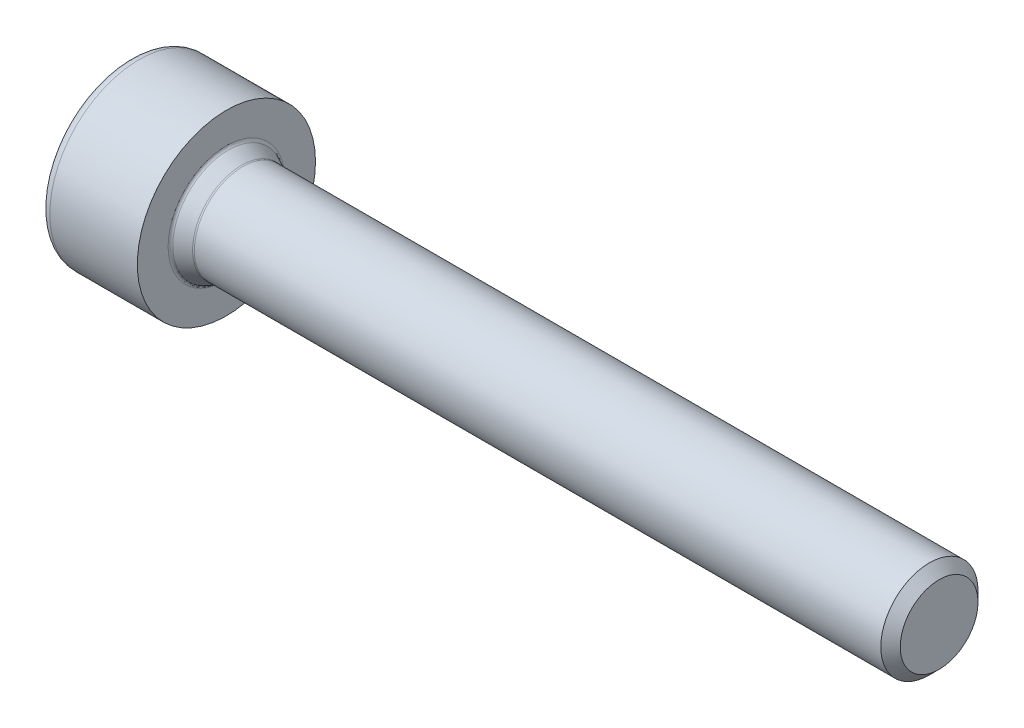
ISO-10303-21;
HEADER;
FILE_DESCRIPTION(('STEP AP214'),'2;1');
FILE_NAME('part.step','',(''),(''),'','','');
FILE_SCHEMA(('AUTOMOTIVE_DESIGN { 1 0 10303 214 1 1 1 1 }'));
ENDSEC;
DATA;
#1=APPLICATION_CONTEXT('core data for automotive mechanical design processes');
#2=APPLICATION_PROTOCOL_DEFINITION('international standard','automotive_design',2000,#1);
#3=PRODUCT_CONTEXT('',#1,'mechanical');
#4=PRODUCT('Part','Part','',(#3));
#5=PRODUCT_RELATED_PRODUCT_CATEGORY('part','',(#4));
#6=PRODUCT_DEFINITION_FORMATION('','',#4);
#7=PRODUCT_DEFINITION_CONTEXT('part definition',#1,'design');
#8=PRODUCT_DEFINITION('design','',#6,#7);
#9=PRODUCT_DEFINITION_SHAPE('','',#8);
#10=(LENGTH_UNIT() NAMED_UNIT(*) SI_UNIT(.MILLI.,.METRE.));
#11=(NAMED_UNIT(*) PLANE_ANGLE_UNIT() SI_UNIT($,.RADIAN.));
#12=(NAMED_UNIT(*) SI_UNIT($,.STERADIAN.) SOLID_ANGLE_UNIT());
#13=UNCERTAINTY_MEASURE_WITH_UNIT(LENGTH_MEASURE(1.E-05),#10,'distance_accuracy_value','');
#14=(GEOMETRIC_REPRESENTATION_CONTEXT(3) GLOBAL_UNCERTAINTY_ASSIGNED_CONTEXT((#13)) GLOBAL_UNIT_ASSIGNED_CONTEXT((#10,
#11,#12)) REPRESENTATION_CONTEXT('',''));
#15=CARTESIAN_POINT('',(0.,0.,0.));
#16=DIRECTION('',(0.,0.,1.));
#17=DIRECTION('',(1.,0.,0.));
#18=AXIS2_PLACEMENT_3D('',#15,#16,#17);
#19=CARTESIAN_POINT('',(-2.7,0.,0.));
#20=DIRECTION('',(-1.,0.,0.));
#21=DIRECTION('',(0.,0.,1.));
#22=AXIS2_PLACEMENT_3D('',#19,#20,#21);
#23=TOROIDAL_SURFACE('',#22,2.45,0.3);
#24=CARTESIAN_POINT('',(-2.7,0.,0.));
#25=DIRECTION('',(-1.,0.,0.));
#26=DIRECTION('',(0.,0.,-1.));
#27=AXIS2_PLACEMENT_3D('',#24,#25,#26);
#28=CIRCLE('',#27,2.75);
#29=CARTESIAN_POINT('',(-2.7,0.,-2.75));
#30=VERTEX_POINT('',#29);
#31=EDGE_CURVE('E11',#30,#30,#28,.T.);
#32=ORIENTED_EDGE('',*,*,#31,.T.);
#33=EDGE_LOOP('',(#32));
#34=FACE_BOUND('',#33,.T.);
#35=CARTESIAN_POINT('',(-3.,0.,0.));
#36=DIRECTION('',(-1.,0.,0.));
#37=DIRECTION('',(0.,0.,-1.));
#38=AXIS2_PLACEMENT_3D('',#35,#36,#37);
#39=CIRCLE('',#38,2.45);
#40=CARTESIAN_POINT('',(-3.,0.,-2.45));
#41=VERTEX_POINT('',#40);
#42=EDGE_CURVE('E32',#41,#41,#39,.T.);
#43=ORIENTED_EDGE('',*,*,#42,.F.);
#44=EDGE_LOOP('',(#43));
#45=FACE_BOUND('',#44,.T.);
#46=ADVANCED_FACE('F17',(#34,#45),#23,.T.);
#47=CARTESIAN_POINT('',(-3.,0.,-1.9425));
#48=DIRECTION('',(-1.,0.,0.));
#49=DIRECTION('',(0.,0.,-1.));
#50=AXIS2_PLACEMENT_3D('',#47,#48,#49);
#51=PLANE('',#50);
#52=ORIENTED_EDGE('',*,*,#42,.T.);
#53=EDGE_LOOP('',(#52));
#54=FACE_BOUND('',#53,.T.);
#55=DIRECTION('',(0.,-1.,1.432068236885E-12));
#56=VECTOR('',#55,1.);
#57=CARTESIAN_POINT('',(-3.,-0.7047872019269,-1.25));
#58=LINE('',#57,#56);
#59=CARTESIAN_POINT('',(-2.99999999999999,-0.704787201926908,-1.25));
#60=VERTEX_POINT('',#59);
#61=CARTESIAN_POINT('',(-3.,-0.721687836487,-1.25));
#62=VERTEX_POINT('',#61);
#63=EDGE_CURVE('E41',#60,#62,#58,.T.);
#64=ORIENTED_EDGE('',*,*,#63,.F.);
#65=CARTESIAN_POINT('',(-3.,0.,0.));
#66=DIRECTION('',(1.,0.,0.));
#67=DIRECTION('',(0.,-0.491140907266199,-0.871080139372799));
#68=AXIS2_PLACEMENT_3D('',#65,#66,#67);
#69=CIRCLE('',#68,1.435);
#70=CARTESIAN_POINT('',(-3.,0.7047872019269,-1.25));
#71=VERTEX_POINT('',#70);
#72=EDGE_CURVE('E245',#60,#71,#69,.T.);
#73=ORIENTED_EDGE('',*,*,#72,.T.);
#74=DIRECTION('',(0.,-1.,-5.912208317431E-13));
#75=VECTOR('',#74,1.);
#76=CARTESIAN_POINT('',(-3.,0.721687836487,-1.25));
#77=LINE('',#76,#75);
#78=CARTESIAN_POINT('',(-3.,0.721687836487,-1.25));
#79=VERTEX_POINT('',#78);
#80=EDGE_CURVE('E447',#79,#71,#77,.T.);
#81=ORIENTED_EDGE('',*,*,#80,.F.);
#82=DIRECTION('',(0.,0.50000000000122,0.866025403783734));
#83=VECTOR('',#82,1.);
#84=CARTESIAN_POINT('',(-3.,0.721687836487,-1.25));
#85=LINE('',#84,#83);
#86=CARTESIAN_POINT('',(-3.,0.730138153767066,-1.23536362113087));
#87=VERTEX_POINT('',#86);
#88=EDGE_CURVE('E247',#79,#87,#85,.T.);
#89=ORIENTED_EDGE('',*,*,#88,.T.);
#90=CARTESIAN_POINT('',(-3.,0.,0.));
#91=DIRECTION('',(1.,0.,0.));
#92=DIRECTION('',(0.,0.508807075795911,-0.860880572216619));
#93=AXIS2_PLACEMENT_3D('',#90,#91,#92);
#94=CIRCLE('',#93,1.435);
#95=CARTESIAN_POINT('',(-3.,1.434925355694,-0.01463637886915));
#96=VERTEX_POINT('',#95);
#97=EDGE_CURVE('E255',#87,#96,#94,.T.);
#98=ORIENTED_EDGE('',*,*,#97,.T.);
#99=DIRECTION('',(0.,0.499999999999394,0.866025403784789));
#100=VECTOR('',#99,1.);
#101=CARTESIAN_POINT('',(-3.,1.434925355694,-0.01463637886915));
#102=LINE('',#101,#100);
#103=CARTESIAN_POINT('',(-3.,1.443375672974,0.));
#104=VERTEX_POINT('',#103);
#105=EDGE_CURVE('E261',#96,#104,#102,.T.);
#106=ORIENTED_EDGE('',*,*,#105,.T.);
#107=DIRECTION('',(0.,-0.499999999998695,0.866025403785192));
#108=VECTOR('',#107,1.);
#109=CARTESIAN_POINT('',(-3.,1.443375672974,0.));
#110=LINE('',#109,#108);
#111=CARTESIAN_POINT('',(-3.,1.434925355694,0.0146363788690559));
#112=VERTEX_POINT('',#111);
#113=EDGE_CURVE('E277',#104,#112,#110,.T.);
#114=ORIENTED_EDGE('',*,*,#113,.T.);
#115=CARTESIAN_POINT('',(-3.,0.,0.));
#116=DIRECTION('',(1.,0.,0.));
#117=DIRECTION('',(0.,0.999947983062032,0.0101995671561803));
#118=AXIS2_PLACEMENT_3D('',#115,#116,#117);
#119=CIRCLE('',#118,1.435);
#120=CARTESIAN_POINT('',(-3.,0.7301381537671,1.235363621131));
#121=VERTEX_POINT('',#120);
#122=EDGE_CURVE('E271',#112,#121,#119,.T.);
#123=ORIENTED_EDGE('',*,*,#122,.T.);
#124=DIRECTION('',(0.,-0.500000000000522,0.866025403784138));
#125=VECTOR('',#124,1.);
#126=CARTESIAN_POINT('',(-3.,0.7301381537671,1.235363621131));
#127=LINE('',#126,#125);
#128=CARTESIAN_POINT('',(-3.,0.721687836487,1.25));
#129=VERTEX_POINT('',#128);
#130=EDGE_CURVE('E278',#121,#129,#127,.T.);
#131=ORIENTED_EDGE('',*,*,#130,.T.);
#132=DIRECTION('',(0.,1.,-1.432068236885E-12));
#133=VECTOR('',#132,1.);
#134=CARTESIAN_POINT('',(-3.,0.7047872019269,1.25));
#135=LINE('',#134,#133);
#136=CARTESIAN_POINT('',(-2.99999999999999,0.704787201926908,1.25));
#137=VERTEX_POINT('',#136);
#138=EDGE_CURVE('E270',#137,#129,#135,.T.);
#139=ORIENTED_EDGE('',*,*,#138,.F.);
#140=CARTESIAN_POINT('',(-3.,0.,0.));
#141=DIRECTION('',(1.,0.,0.));
#142=DIRECTION('',(0.,0.491140907266199,0.871080139372799));
#143=AXIS2_PLACEMENT_3D('',#140,#141,#142);
#144=CIRCLE('',#143,1.435);
#145=CARTESIAN_POINT('',(-3.,-0.7047872019269,1.25));
#146=VERTEX_POINT('',#145);
#147=EDGE_CURVE('E291',#137,#146,#144,.T.);
#148=ORIENTED_EDGE('',*,*,#147,.T.);
#149=DIRECTION('',(0.,1.,5.912208317431E-13));
#150=VECTOR('',#149,1.);
#151=CARTESIAN_POINT('',(-3.,-0.721687836487,1.25));
#152=LINE('',#151,#150);
#153=CARTESIAN_POINT('',(-3.,-0.721687836487,1.25));
#154=VERTEX_POINT('',#153);
#155=EDGE_CURVE('E454',#154,#146,#152,.T.);
#156=ORIENTED_EDGE('',*,*,#155,.F.);
#157=DIRECTION('',(0.,-0.50000000000122,-0.866025403783734));
#158=VECTOR('',#157,1.);
#159=CARTESIAN_POINT('',(-3.,-0.721687836487,1.25));
#160=LINE('',#159,#158);
#161=CARTESIAN_POINT('',(-3.,-0.730138153767066,1.23536362113087));
#162=VERTEX_POINT('',#161);
#163=EDGE_CURVE('E169',#154,#162,#160,.T.);
#164=ORIENTED_EDGE('',*,*,#163,.T.);
#165=CARTESIAN_POINT('',(-3.,0.,0.));
#166=DIRECTION('',(1.,0.,0.));
#167=DIRECTION('',(0.,-0.508807075795911,0.860880572216619));
#168=AXIS2_PLACEMENT_3D('',#165,#166,#167);
#169=CIRCLE('',#168,1.435);
#170=CARTESIAN_POINT('',(-3.,-1.434925355694,0.01463637886916));
#171=VERTEX_POINT('',#170);
#172=EDGE_CURVE('E297',#162,#171,#169,.T.);
#173=ORIENTED_EDGE('',*,*,#172,.T.);
#174=DIRECTION('',(0.,-0.499999999999394,-0.866025403784789));
#175=VECTOR('',#174,1.);
#176=CARTESIAN_POINT('',(-3.,-1.434925355694,0.01463637886916));
#177=LINE('',#176,#175);
#178=CARTESIAN_POINT('',(-3.,-1.443375672974,0.));
#179=VERTEX_POINT('',#178);
#180=EDGE_CURVE('E233',#171,#179,#177,.T.);
#181=ORIENTED_EDGE('',*,*,#180,.T.);
#182=DIRECTION('',(0.,0.499999999998695,-0.866025403785192));
#183=VECTOR('',#182,1.);
#184=CARTESIAN_POINT('',(-3.,-1.443375672974,0.));
#185=LINE('',#184,#183);
#186=CARTESIAN_POINT('',(-3.,-1.434925355694,-0.0146363788690559));
#187=VERTEX_POINT('',#186);
#188=EDGE_CURVE('E231',#179,#187,#185,.T.);
#189=ORIENTED_EDGE('',*,*,#188,.T.);
#190=CARTESIAN_POINT('',(-3.,0.,0.));
#191=DIRECTION('',(1.,0.,0.));
#192=DIRECTION('',(0.,-0.999947983062032,-0.0101995671561803));
#193=AXIS2_PLACEMENT_3D('',#190,#191,#192);
#194=CIRCLE('',#193,1.435);
#195=CARTESIAN_POINT('',(-3.,-0.7301381537671,-1.235363621131));
#196=VERTEX_POINT('',#195);
#197=EDGE_CURVE('E105',#187,#196,#194,.T.);
#198=ORIENTED_EDGE('',*,*,#197,.T.);
#199=DIRECTION('',(0.,0.500000000000522,-0.866025403784138));
#200=VECTOR('',#199,1.);
#201=CARTESIAN_POINT('',(-3.,-0.7301381537671,-1.235363621131));
#202=LINE('',#201,#200);
#203=EDGE_CURVE('E115',#196,#62,#202,.T.);
#204=ORIENTED_EDGE('',*,*,#203,.T.);
#205=EDGE_LOOP('',(#64,#73,#81,#89,#98,#106,#114,#123,#131,#139,#148,#156,#164,#173,#181,#189,
#198,#204));
#206=FACE_BOUND('',#205,.T.);
#207=ADVANCED_FACE('F434',(#54,#206),#51,.T.);
#208=CARTESIAN_POINT('',(-1.15,-1.443375672974,0.));
#209=DIRECTION('',(0.,-0.866025403784429,-0.500000000000017));
#210=DIRECTION('',(0.,-0.500000000000017,0.866025403784429));
#211=AXIS2_PLACEMENT_3D('',#208,#209,#210);
#212=PLANE('',#211);
#213=DIRECTION('',(1.,0.,0.));
#214=VECTOR('',#213,1.);
#215=CARTESIAN_POINT('',(-3.,-1.443375672974,0.));
#216=LINE('',#215,#214);
#217=CARTESIAN_POINT('',(-1.15,-1.443375672974,0.));
#218=VERTEX_POINT('',#217);
#219=EDGE_CURVE('E311',#179,#218,#216,.T.);
#220=ORIENTED_EDGE('',*,*,#219,.T.);
#221=DIRECTION('',(0.,-0.500000000000017,0.866025403784429));
#222=VECTOR('',#221,1.);
#223=CARTESIAN_POINT('',(-1.15,-1.082531754731,-0.625));
#224=LINE('',#223,#222);
#225=CARTESIAN_POINT('',(-1.15,-1.082531754731,-0.625));
#226=VERTEX_POINT('',#225);
#227=EDGE_CURVE('E181',#226,#218,#224,.T.);
#228=ORIENTED_EDGE('',*,*,#227,.F.);
#229=DIRECTION('',(0.,-0.500000000000017,0.866025403784429));
#230=VECTOR('',#229,1.);
#231=CARTESIAN_POINT('',(-1.15,-0.721687836487,-1.25));
#232=LINE('',#231,#230);
#233=CARTESIAN_POINT('',(-1.15,-0.721687836487,-1.25));
#234=VERTEX_POINT('',#233);
#235=EDGE_CURVE('E188',#234,#226,#232,.T.);
#236=ORIENTED_EDGE('',*,*,#235,.F.);
#237=DIRECTION('',(1.,0.,0.));
#238=VECTOR('',#237,1.);
#239=CARTESIAN_POINT('',(-3.,-0.721687836487,-1.25));
#240=LINE('',#239,#238);
#241=EDGE_CURVE('E226',#62,#234,#240,.T.);
#242=ORIENTED_EDGE('',*,*,#241,.F.);
#243=ORIENTED_EDGE('',*,*,#203,.F.);
#244=CARTESIAN_POINT('',(-2.815,-1.082531754731,-0.625));
#245=CARTESIAN_POINT('',(-2.815,-1.063859268376,-0.6573416950703));
#246=CARTESIAN_POINT('',(-2.818363416491,-1.026399448935,-0.7222240055847));
#247=CARTESIAN_POINT('',(-2.833438309549,-0.9700812084172,-0.8197700595537));
#248=CARTESIAN_POINT('',(-2.858584905517,-0.9129863664108,-0.9186612267588));
#249=CARTESIAN_POINT('',(-2.893859610456,-0.8547889128883,-1.019462173131));
#250=CARTESIAN_POINT('',(-2.939818231274,-0.7944976023018,-1.123889786322));
#251=CARTESIAN_POINT('',(-2.978600363732,-0.7519237920144,-1.197629788811));
#252=CARTESIAN_POINT('',(-3.,-0.7301381537671,-1.235363621131));
#253=B_SPLINE_CURVE_WITH_KNOTS('',3,(#244,#245,#246,#247,#248,#249,#250,#251,#252),
.UNSPECIFIED.,.F.,.F.,(4,1,1,1,1,1,4),(0.,0.1666666666667,0.3333333333333,0.5,0.6666666666667,
0.8333333333333,1.),.UNSPECIFIED.);
#254=CARTESIAN_POINT('',(-2.815,-1.082531754731,-0.625));
#255=VERTEX_POINT('',#254);
#256=EDGE_CURVE('E221',#255,#196,#253,.T.);
#257=ORIENTED_EDGE('',*,*,#256,.F.);
#258=CARTESIAN_POINT('',(-2.8149999999999,-1.0825317547306,-0.62499999999977));
#259=CARTESIAN_POINT('',(-2.81496785270438,-1.10173069672346,-0.591746457016578));
#260=CARTESIAN_POINT('',(-2.8167685143763,-1.12091987742702,-0.558509821082382));
#261=CARTESIAN_POINT('',(-2.82378282879434,-1.15910898332761,-0.492364349366937));
#262=CARTESIAN_POINT('',(-2.82899042505695,-1.17810918373836,-0.459455036901525));
#263=CARTESIAN_POINT('',(-2.84246640129993,-1.21553848926201,-0.394625578042558));
#264=CARTESIAN_POINT('',(-2.8506879852696,-1.23397188551018,-0.362697999184671));
#265=CARTESIAN_POINT('',(-2.86982507004518,-1.27048736991153,-0.299451324938551));
#266=CARTESIAN_POINT('',(-2.88074136635811,-1.28856935262031,-0.268132412185355));
#267=CARTESIAN_POINT('',(-2.90757365650079,-1.32835068916778,-0.199229116092153));
#268=CARTESIAN_POINT('',(-2.92406186281485,-1.34995237159174,-0.161813904604891));
#269=CARTESIAN_POINT('',(-2.95998951151082,-1.39277863287159,-0.0876366441699655));
#270=CARTESIAN_POINT('',(-2.97945549868683,-1.4139976808524,-0.0508841749789755));
#271=CARTESIAN_POINT('',(-2.99999999999995,-1.43492535569394,-0.0146363788691386));
#272=B_SPLINE_CURVE_WITH_KNOTS('',3,(#258,#259,#260,#261,#262,#263,#264,#265,#266,#267,#268,
#269,#270,#271),.UNSPECIFIED.,.F.,.F.,(4,2,2,2,2,2,4),(0.,0.115120325309989,0.230036556089489,
0.343239313166312,0.456475528920214,0.595093846087562,0.735028832969157),.UNSPECIFIED.);
#273=EDGE_CURVE('E225',#255,#187,#272,.T.);
#274=ORIENTED_EDGE('',*,*,#273,.T.);
#275=ORIENTED_EDGE('',*,*,#188,.F.);
#276=EDGE_LOOP('',(#220,#228,#236,#242,#243,#257,#274,#275));
#277=FACE_BOUND('',#276,.T.);
#278=ADVANCED_FACE('F318',(#277),#212,.F.);
#279=CARTESIAN_POINT('',(-2.9075,0.,0.));
#280=DIRECTION('',(-1.,0.,0.));
#281=DIRECTION('',(0.,0.,-1.));
#282=AXIS2_PLACEMENT_3D('',#279,#280,#281);
#283=CONICAL_SURFACE('',#282,1.3425,0.7853981633973);
#284=ORIENTED_EDGE('',*,*,#197,.F.);
#285=ORIENTED_EDGE('',*,*,#273,.F.);
#286=ORIENTED_EDGE('',*,*,#256,.T.);
#287=EDGE_LOOP('',(#284,#285,#286));
#288=FACE_BOUND('',#287,.T.);
#289=ADVANCED_FACE('F321',(#288),#283,.F.);
#290=CARTESIAN_POINT('',(-1.15,-0.721687836487,-1.25));
#291=DIRECTION('',(0.,0.,-1.));
#292=DIRECTION('',(0.,-1.,0.));
#293=AXIS2_PLACEMENT_3D('',#290,#291,#292);
#294=PLANE('',#293);
#295=ORIENTED_EDGE('',*,*,#241,.T.);
#296=DIRECTION('',(0.,-1.,0.));
#297=VECTOR('',#296,1.);
#298=CARTESIAN_POINT('',(-1.15,0.,-1.25));
#299=LINE('',#298,#297);
#300=CARTESIAN_POINT('',(-1.15,0.,-1.25));
#301=VERTEX_POINT('',#300);
#302=EDGE_CURVE('E190',#301,#234,#299,.T.);
#303=ORIENTED_EDGE('',*,*,#302,.F.);
#304=DIRECTION('',(0.,-1.,0.));
#305=VECTOR('',#304,1.);
#306=CARTESIAN_POINT('',(-1.15,0.721687836487,-1.25));
#307=LINE('',#306,#305);
#308=CARTESIAN_POINT('',(-1.15,0.721687836487,-1.25));
#309=VERTEX_POINT('',#308);
#310=EDGE_CURVE('E199',#309,#301,#307,.T.);
#311=ORIENTED_EDGE('',*,*,#310,.F.);
#312=DIRECTION('',(1.,0.,0.));
#313=VECTOR('',#312,1.);
#314=CARTESIAN_POINT('',(-3.,0.721687836487,-1.25));
#315=LINE('',#314,#313);
#316=EDGE_CURVE('E239',#79,#309,#315,.T.);
#317=ORIENTED_EDGE('',*,*,#316,.F.);
#318=ORIENTED_EDGE('',*,*,#80,.T.);
#319=CARTESIAN_POINT('',(-2.815,0.,-1.25));
#320=CARTESIAN_POINT('',(-2.815,0.03734497270983,-1.25));
#321=CARTESIAN_POINT('',(-2.818363416491,0.112264611592,-1.25));
#322=CARTESIAN_POINT('',(-2.833438309549,0.2249010926268,-1.25));
#323=CARTESIAN_POINT('',(-2.858584905517,0.3390907766395,-1.25));
#324=CARTESIAN_POINT('',(-2.893859610456,0.4554856836845,-1.25));
#325=CARTESIAN_POINT('',(-2.939818231274,0.5760683048575,-1.25));
#326=CARTESIAN_POINT('',(-2.978600363732,0.6612159254323,-1.25));
#327=CARTESIAN_POINT('',(-3.,0.7047872019269,-1.25));
#328=B_SPLINE_CURVE_WITH_KNOTS('',3,(#319,#320,#321,#322,#323,#324,#325,#326,#327),
.UNSPECIFIED.,.F.,.F.,(4,1,1,1,1,1,4),(0.,0.1666666666667,0.3333333333333,0.5,0.6666666666667,
0.8333333333333,1.),.UNSPECIFIED.);
#329=CARTESIAN_POINT('',(-2.81499999999999,0.,-1.25));
#330=VERTEX_POINT('',#329);
#331=EDGE_CURVE('E234',#330,#71,#328,.T.);
#332=ORIENTED_EDGE('',*,*,#331,.F.);
#333=CARTESIAN_POINT('',(-2.81499999999997,0.,-1.25));
#334=CARTESIAN_POINT('',(-2.81496785270444,-0.0383978839857061,-1.25));
#335=CARTESIAN_POINT('',(-2.81676851437635,-0.076776245392834,-1.25));
#336=CARTESIAN_POINT('',(-2.82378282879438,-0.153154457194003,-1.25));
#337=CARTESIAN_POINT('',(-2.82899042505698,-0.191154858015504,-1.25));
#338=CARTESIAN_POINT('',(-2.84246640129995,-0.266013469062785,-1.25));
#339=CARTESIAN_POINT('',(-2.8506879852696,-0.302880261559132,-1.25));
#340=CARTESIAN_POINT('',(-2.86982507004516,-0.37591123036182,-1.25));
#341=CARTESIAN_POINT('',(-2.88074136635809,-0.412075195779387,-1.25));
#342=CARTESIAN_POINT('',(-2.90757365650077,-0.491637868874359,-1.25));
#343=CARTESIAN_POINT('',(-2.92406186281484,-0.534841233722319,-1.25));
#344=CARTESIAN_POINT('',(-2.95998951151084,-0.620493756282116,-1.25));
#345=CARTESIAN_POINT('',(-2.97945549868686,-0.662931852243763,-1.25));
#346=CARTESIAN_POINT('',(-3.00000000000001,-0.704787201926896,-1.25));
#347=B_SPLINE_CURVE_WITH_KNOTS('',3,(#333,#334,#335,#336,#337,#338,#339,#340,#341,#342,#343,
#344,#345,#346),.UNSPECIFIED.,.F.,.F.,(4,2,2,2,2,2,4),(0.,0.115120325309978,0.230036556089467,
0.343239313166279,0.45647552892017,0.595093846087656,0.735028832969392),.UNSPECIFIED.);
#348=EDGE_CURVE('E244',#330,#60,#347,.T.);
#349=ORIENTED_EDGE('',*,*,#348,.T.);
#350=ORIENTED_EDGE('',*,*,#63,.T.);
#351=EDGE_LOOP('',(#295,#303,#311,#317,#318,#332,#349,#350));
#352=FACE_BOUND('',#351,.T.);
#353=ADVANCED_FACE('F324',(#352),#294,.F.);
#354=CARTESIAN_POINT('',(-2.9075,0.,0.));
#355=DIRECTION('',(-1.,0.,0.));
#356=DIRECTION('',(0.,0.,-1.));
#357=AXIS2_PLACEMENT_3D('',#354,#355,#356);
#358=CONICAL_SURFACE('',#357,1.3425,0.7853981633973);
#359=ORIENTED_EDGE('',*,*,#72,.F.);
#360=ORIENTED_EDGE('',*,*,#348,.F.);
#361=ORIENTED_EDGE('',*,*,#331,.T.);
#362=EDGE_LOOP('',(#359,#360,#361));
#363=FACE_BOUND('',#362,.T.);
#364=ADVANCED_FACE('F327',(#363),#358,.F.);
#365=CARTESIAN_POINT('',(-1.15,0.721687836487,-1.25));
#366=DIRECTION('',(0.,0.866025403784429,-0.500000000000017));
#367=DIRECTION('',(0.,-0.500000000000017,-0.866025403784429));
#368=AXIS2_PLACEMENT_3D('',#365,#366,#367);
#369=PLANE('',#368);
#370=ORIENTED_EDGE('',*,*,#316,.T.);
#371=DIRECTION('',(0.,-0.500000000000017,-0.866025403784429));
#372=VECTOR('',#371,1.);
#373=CARTESIAN_POINT('',(-1.15,1.082531754731,-0.625));
#374=LINE('',#373,#372);
#375=CARTESIAN_POINT('',(-1.15,1.082531754731,-0.625));
#376=VERTEX_POINT('',#375);
#377=EDGE_CURVE('E185',#376,#309,#374,.T.);
#378=ORIENTED_EDGE('',*,*,#377,.F.);
#379=DIRECTION('',(0.,-0.500000000000017,-0.866025403784429));
#380=VECTOR('',#379,1.);
#381=CARTESIAN_POINT('',(-1.15,1.443375672974,0.));
#382=LINE('',#381,#380);
#383=CARTESIAN_POINT('',(-1.15,1.443375672974,0.));
#384=VERTEX_POINT('',#383);
#385=EDGE_CURVE('E195',#384,#376,#382,.T.);
#386=ORIENTED_EDGE('',*,*,#385,.F.);
#387=DIRECTION('',(1.,0.,0.));
#388=VECTOR('',#387,1.);
#389=CARTESIAN_POINT('',(-3.,1.443375672974,0.));
#390=LINE('',#389,#388);
#391=EDGE_CURVE('E254',#104,#384,#390,.T.);
#392=ORIENTED_EDGE('',*,*,#391,.F.);
#393=ORIENTED_EDGE('',*,*,#105,.F.);
#394=CARTESIAN_POINT('',(-2.815,1.082531754731,-0.625));
#395=CARTESIAN_POINT('',(-2.815,1.101204241085,-0.5926583049296));
#396=CARTESIAN_POINT('',(-2.818363416491,1.138664060527,-0.5277759944153));
#397=CARTESIAN_POINT('',(-2.833438309549,1.194982301044,-0.4302299404463));
#398=CARTESIAN_POINT('',(-2.858584905517,1.25207714305,-0.3313387732412));
#399=CARTESIAN_POINT('',(-2.893859610456,1.310274596573,-0.2305378268691));
#400=CARTESIAN_POINT('',(-2.939818231274,1.370565907159,-0.1261102136783));
#401=CARTESIAN_POINT('',(-2.978600363732,1.413139717447,-0.05237021118877));
#402=CARTESIAN_POINT('',(-3.,1.434925355694,-0.01463637886915));
#403=B_SPLINE_CURVE_WITH_KNOTS('',3,(#394,#395,#396,#397,#398,#399,#400,#401,#402),
.UNSPECIFIED.,.F.,.F.,(4,1,1,1,1,1,4),(0.,0.1666666666667,0.3333333333333,0.5,0.6666666666667,
0.8333333333333,1.),.UNSPECIFIED.);
#404=CARTESIAN_POINT('',(-2.815,1.082531754731,-0.625));
#405=VERTEX_POINT('',#404);
#406=EDGE_CURVE('E248',#405,#96,#403,.T.);
#407=ORIENTED_EDGE('',*,*,#406,.F.);
#408=CARTESIAN_POINT('',(-2.81499999999996,1.08253175473065,-0.624999999999797));
#409=CARTESIAN_POINT('',(-2.81496785270442,1.0633328127378,-0.658253542982981));
#410=CARTESIAN_POINT('',(-2.81676851437632,1.04414363203424,-0.691490178917168));
#411=CARTESIAN_POINT('',(-2.82378282879433,1.00595452613366,-0.757635650632599));
#412=CARTESIAN_POINT('',(-2.82899042505692,0.986954325722908,-0.790544963098005));
#413=CARTESIAN_POINT('',(-2.84246640129987,0.949525020199271,-0.85537442195696));
#414=CARTESIAN_POINT('',(-2.85068798526952,0.931091623951099,-0.887302000814842));
#415=CARTESIAN_POINT('',(-2.86982507004506,0.894576139549758,-0.950548675060951));
#416=CARTESIAN_POINT('',(-2.88074136635799,0.876494156840976,-0.981867587814142));
#417=CARTESIAN_POINT('',(-2.90757365650067,0.836712820293456,-1.05077088390744));
#418=CARTESIAN_POINT('',(-2.92406186281476,0.815111137869441,-1.0881860953948));
#419=CARTESIAN_POINT('',(-2.95998951151081,0.772284876589475,-1.16236335582992));
#420=CARTESIAN_POINT('',(-2.97945549868686,0.751065828608618,-1.199115825021));
#421=CARTESIAN_POINT('',(-3.00000000000004,0.730138153767019,-1.23536362113093));
#422=B_SPLINE_CURVE_WITH_KNOTS('',3,(#408,#409,#410,#411,#412,#413,#414,#415,#416,#417,#418,
#419,#420,#421),.UNSPECIFIED.,.F.,.F.,(4,2,2,2,2,2,4),(0.,0.11512032530996,0.23003655608943,
0.343239313166223,0.456475528920095,0.595093846087792,0.735028832969743),.UNSPECIFIED.);
#423=EDGE_CURVE('E253',#405,#87,#422,.T.);
#424=ORIENTED_EDGE('',*,*,#423,.T.);
#425=ORIENTED_EDGE('',*,*,#88,.F.);
#426=EDGE_LOOP('',(#370,#378,#386,#392,#393,#407,#424,#425));
#427=FACE_BOUND('',#426,.T.);
#428=ADVANCED_FACE('F332',(#427),#369,.F.);
#429=CARTESIAN_POINT('',(-2.9075,0.,0.));
#430=DIRECTION('',(-1.,0.,0.));
#431=DIRECTION('',(0.,0.,-1.));
#432=AXIS2_PLACEMENT_3D('',#429,#430,#431);
#433=CONICAL_SURFACE('',#432,1.3425,0.7853981633973);
#434=ORIENTED_EDGE('',*,*,#406,.T.);
#435=ORIENTED_EDGE('',*,*,#97,.F.);
#436=ORIENTED_EDGE('',*,*,#423,.F.);
#437=EDGE_LOOP('',(#434,#435,#436));
#438=FACE_BOUND('',#437,.T.);
#439=ADVANCED_FACE('F337',(#438),#433,.F.);
#440=CARTESIAN_POINT('',(-1.15,1.443375672974,0.));
#441=DIRECTION('',(0.,0.866025403784429,0.500000000000017));
#442=DIRECTION('',(0.,0.500000000000017,-0.866025403784429));
#443=AXIS2_PLACEMENT_3D('',#440,#441,#442);
#444=PLANE('',#443);
#445=ORIENTED_EDGE('',*,*,#391,.T.);
#446=DIRECTION('',(0.,0.500000000000017,-0.866025403784429));
#447=VECTOR('',#446,1.);
#448=CARTESIAN_POINT('',(-1.15,1.082531754731,0.625));
#449=LINE('',#448,#447);
#450=CARTESIAN_POINT('',(-1.15,1.082531754731,0.625));
#451=VERTEX_POINT('',#450);
#452=EDGE_CURVE('E200',#451,#384,#449,.T.);
#453=ORIENTED_EDGE('',*,*,#452,.F.);
#454=DIRECTION('',(0.,0.500000000000017,-0.866025403784429));
#455=VECTOR('',#454,1.);
#456=CARTESIAN_POINT('',(-1.15,0.721687836487,1.25));
#457=LINE('',#456,#455);
#458=CARTESIAN_POINT('',(-1.15,0.721687836487,1.25));
#459=VERTEX_POINT('',#458);
#460=EDGE_CURVE('E175',#459,#451,#457,.T.);
#461=ORIENTED_EDGE('',*,*,#460,.F.);
#462=DIRECTION('',(1.,0.,0.));
#463=VECTOR('',#462,1.);
#464=CARTESIAN_POINT('',(-3.,0.721687836487,1.25));
#465=LINE('',#464,#463);
#466=EDGE_CURVE('E290',#129,#459,#465,.T.);
#467=ORIENTED_EDGE('',*,*,#466,.F.);
#468=ORIENTED_EDGE('',*,*,#130,.F.);
#469=CARTESIAN_POINT('',(-2.815,1.082531754731,0.625));
#470=CARTESIAN_POINT('',(-2.815,1.063859268376,0.6573416950703));
#471=CARTESIAN_POINT('',(-2.818363416491,1.026399448935,0.7222240055847));
#472=CARTESIAN_POINT('',(-2.833438309549,0.9700812084172,0.8197700595537));
#473=CARTESIAN_POINT('',(-2.858584905517,0.9129863664108,0.9186612267588));
#474=CARTESIAN_POINT('',(-2.893859610456,0.8547889128883,1.019462173131));
#475=CARTESIAN_POINT('',(-2.939818231274,0.7944976023018,1.123889786322));
#476=CARTESIAN_POINT('',(-2.978600363732,0.7519237920144,1.197629788811));
#477=CARTESIAN_POINT('',(-3.,0.7301381537671,1.235363621131));
#478=B_SPLINE_CURVE_WITH_KNOTS('',3,(#469,#470,#471,#472,#473,#474,#475,#476,#477),
.UNSPECIFIED.,.F.,.F.,(4,1,1,1,1,1,4),(0.,0.1666666666667,0.3333333333333,0.5,0.6666666666667,
0.8333333333333,1.),.UNSPECIFIED.);
#479=CARTESIAN_POINT('',(-2.815,1.082531754731,0.625));
#480=VERTEX_POINT('',#479);
#481=EDGE_CURVE('E264',#480,#121,#478,.T.);
#482=ORIENTED_EDGE('',*,*,#481,.F.);
#483=CARTESIAN_POINT('',(-2.8149999999999,1.0825317547306,0.62499999999977));
#484=CARTESIAN_POINT('',(-2.81496785270438,1.10173069672346,0.591746457016578));
#485=CARTESIAN_POINT('',(-2.8167685143763,1.12091987742702,0.558509821082382));
#486=CARTESIAN_POINT('',(-2.82378282879434,1.15910898332761,0.492364349366937));
#487=CARTESIAN_POINT('',(-2.82899042505695,1.17810918373836,0.459455036901525));
#488=CARTESIAN_POINT('',(-2.84246640129993,1.21553848926201,0.394625578042558));
#489=CARTESIAN_POINT('',(-2.8506879852696,1.23397188551018,0.362697999184671));
#490=CARTESIAN_POINT('',(-2.86982507004518,1.27048736991153,0.299451324938551));
#491=CARTESIAN_POINT('',(-2.88074136635811,1.28856935262031,0.268132412185355));
#492=CARTESIAN_POINT('',(-2.90757365650079,1.32835068916778,0.199229116092153));
#493=CARTESIAN_POINT('',(-2.92406186281485,1.34995237159174,0.161813904604891));
#494=CARTESIAN_POINT('',(-2.95998951151082,1.39277863287159,0.0876366441699655));
#495=CARTESIAN_POINT('',(-2.97945549868683,1.4139976808524,0.0508841749789755));
#496=CARTESIAN_POINT('',(-2.99999999999995,1.43492535569394,0.0146363788691386));
#497=B_SPLINE_CURVE_WITH_KNOTS('',3,(#483,#484,#485,#486,#487,#488,#489,#490,#491,#492,#493,
#494,#495,#496),.UNSPECIFIED.,.F.,.F.,(4,2,2,2,2,2,4),(0.,0.115120325309989,0.230036556089489,
0.343239313166312,0.456475528920214,0.595093846087562,0.735028832969157),.UNSPECIFIED.);
#498=EDGE_CURVE('E269',#480,#112,#497,.T.);
#499=ORIENTED_EDGE('',*,*,#498,.T.);
#500=ORIENTED_EDGE('',*,*,#113,.F.);
#501=EDGE_LOOP('',(#445,#453,#461,#467,#468,#482,#499,#500));
#502=FACE_BOUND('',#501,.T.);
#503=ADVANCED_FACE('F356',(#502),#444,.F.);
#504=CARTESIAN_POINT('',(-2.9075,0.,0.));
#505=DIRECTION('',(-1.,0.,0.));
#506=DIRECTION('',(0.,0.,-1.));
#507=AXIS2_PLACEMENT_3D('',#504,#505,#506);
#508=CONICAL_SURFACE('',#507,1.3425,0.7853981633973);
#509=ORIENTED_EDGE('',*,*,#481,.T.);
#510=ORIENTED_EDGE('',*,*,#122,.F.);
#511=ORIENTED_EDGE('',*,*,#498,.F.);
#512=EDGE_LOOP('',(#509,#510,#511));
#513=FACE_BOUND('',#512,.T.);
#514=ADVANCED_FACE('F358',(#513),#508,.F.);
#515=CARTESIAN_POINT('',(-1.15,0.721687836487,1.25));
#516=DIRECTION('',(0.,0.,1.));
#517=DIRECTION('',(0.,1.,0.));
#518=AXIS2_PLACEMENT_3D('',#515,#516,#517);
#519=PLANE('',#518);
#520=ORIENTED_EDGE('',*,*,#138,.T.);
#521=ORIENTED_EDGE('',*,*,#466,.T.);
#522=DIRECTION('',(0.,1.,0.));
#523=VECTOR('',#522,1.);
#524=CARTESIAN_POINT('',(-1.15,0.,1.25));
#525=LINE('',#524,#523);
#526=CARTESIAN_POINT('',(-1.15,0.,1.25));
#527=VERTEX_POINT('',#526);
#528=EDGE_CURVE('E156',#527,#459,#525,.T.);
#529=ORIENTED_EDGE('',*,*,#528,.F.);
#530=DIRECTION('',(0.,1.,0.));
#531=VECTOR('',#530,1.);
#532=CARTESIAN_POINT('',(-1.15,-0.721687836487,1.25));
#533=LINE('',#532,#531);
#534=CARTESIAN_POINT('',(-1.15,-0.721687836487,1.25));
#535=VERTEX_POINT('',#534);
#536=EDGE_CURVE('E147',#535,#527,#533,.T.);
#537=ORIENTED_EDGE('',*,*,#536,.F.);
#538=DIRECTION('',(1.,0.,0.));
#539=VECTOR('',#538,1.);
#540=CARTESIAN_POINT('',(-3.,-0.721687836487,1.25));
#541=LINE('',#540,#539);
#542=EDGE_CURVE('E153',#154,#535,#541,.T.);
#543=ORIENTED_EDGE('',*,*,#542,.F.);
#544=ORIENTED_EDGE('',*,*,#155,.T.);
#545=CARTESIAN_POINT('',(-2.815,0.,1.25));
#546=CARTESIAN_POINT('',(-2.815,-0.03734497270983,1.25));
#547=CARTESIAN_POINT('',(-2.818363416491,-0.112264611592,1.25));
#548=CARTESIAN_POINT('',(-2.833438309549,-0.2249010926268,1.25));
#549=CARTESIAN_POINT('',(-2.858584905517,-0.3390907766395,1.25));
#550=CARTESIAN_POINT('',(-2.893859610456,-0.4554856836845,1.25));
#551=CARTESIAN_POINT('',(-2.939818231274,-0.5760683048575,1.25));
#552=CARTESIAN_POINT('',(-2.978600363732,-0.6612159254323,1.25));
#553=CARTESIAN_POINT('',(-3.,-0.7047872019269,1.25));
#554=B_SPLINE_CURVE_WITH_KNOTS('',3,(#545,#546,#547,#548,#549,#550,#551,#552,#553),
.UNSPECIFIED.,.F.,.F.,(4,1,1,1,1,1,4),(0.,0.1666666666667,0.3333333333333,0.5,0.6666666666667,
0.8333333333333,1.),.UNSPECIFIED.);
#555=CARTESIAN_POINT('',(-2.81499999999999,0.,1.25));
#556=VERTEX_POINT('',#555);
#557=EDGE_CURVE('E170',#556,#146,#554,.T.);
#558=ORIENTED_EDGE('',*,*,#557,.F.);
#559=CARTESIAN_POINT('',(-2.81499999999997,0.,1.25));
#560=CARTESIAN_POINT('',(-2.81496785270444,0.0383978839857061,1.25));
#561=CARTESIAN_POINT('',(-2.81676851437635,0.076776245392834,1.25));
#562=CARTESIAN_POINT('',(-2.82378282879438,0.153154457194003,1.25));
#563=CARTESIAN_POINT('',(-2.82899042505698,0.191154858015504,1.25));
#564=CARTESIAN_POINT('',(-2.84246640129995,0.266013469062785,1.25));
#565=CARTESIAN_POINT('',(-2.8506879852696,0.302880261559132,1.25));
#566=CARTESIAN_POINT('',(-2.86982507004516,0.37591123036182,1.25));
#567=CARTESIAN_POINT('',(-2.88074136635809,0.412075195779387,1.25));
#568=CARTESIAN_POINT('',(-2.90757365650077,0.491637868874359,1.25));
#569=CARTESIAN_POINT('',(-2.92406186281484,0.534841233722319,1.25));
#570=CARTESIAN_POINT('',(-2.95998951151084,0.620493756282116,1.25));
#571=CARTESIAN_POINT('',(-2.97945549868686,0.662931852243763,1.25));
#572=CARTESIAN_POINT('',(-3.00000000000001,0.704787201926896,1.25));
#573=B_SPLINE_CURVE_WITH_KNOTS('',3,(#559,#560,#561,#562,#563,#564,#565,#566,#567,#568,#569,
#570,#571,#572),.UNSPECIFIED.,.F.,.F.,(4,2,2,2,2,2,4),(0.,0.115120325309978,0.230036556089467,
0.343239313166279,0.45647552892017,0.595093846087656,0.735028832969392),.UNSPECIFIED.);
#574=EDGE_CURVE('E285',#556,#137,#573,.T.);
#575=ORIENTED_EDGE('',*,*,#574,.T.);
#576=EDGE_LOOP('',(#520,#521,#529,#537,#543,#544,#558,#575));
#577=FACE_BOUND('',#576,.T.);
#578=ADVANCED_FACE('F150',(#577),#519,.F.);
#579=CARTESIAN_POINT('',(-2.9075,0.,0.));
#580=DIRECTION('',(-1.,0.,0.));
#581=DIRECTION('',(0.,0.,-1.));
#582=AXIS2_PLACEMENT_3D('',#579,#580,#581);
#583=CONICAL_SURFACE('',#582,1.3425,0.7853981633973);
#584=ORIENTED_EDGE('',*,*,#147,.F.);
#585=ORIENTED_EDGE('',*,*,#574,.F.);
#586=ORIENTED_EDGE('',*,*,#557,.T.);
#587=EDGE_LOOP('',(#584,#585,#586));
#588=FACE_BOUND('',#587,.T.);
#589=ADVANCED_FACE('F364',(#588),#583,.F.);
#590=CARTESIAN_POINT('',(-1.15,-0.721687836487,1.25));
#591=DIRECTION('',(0.,-0.866025403784429,0.500000000000017));
#592=DIRECTION('',(0.,0.500000000000017,0.866025403784429));
#593=AXIS2_PLACEMENT_3D('',#590,#591,#592);
#594=PLANE('',#593);
#595=ORIENTED_EDGE('',*,*,#542,.T.);
#596=DIRECTION('',(0.,0.500000000000017,0.866025403784429));
#597=VECTOR('',#596,1.);
#598=CARTESIAN_POINT('',(-1.15,-1.082531754731,0.625));
#599=LINE('',#598,#597);
#600=CARTESIAN_POINT('',(-1.15,-1.082531754731,0.625));
#601=VERTEX_POINT('',#600);
#602=EDGE_CURVE('E161',#601,#535,#599,.T.);
#603=ORIENTED_EDGE('',*,*,#602,.F.);
#604=DIRECTION('',(0.,0.500000000000017,0.866025403784429));
#605=VECTOR('',#604,1.);
#606=CARTESIAN_POINT('',(-1.15,-1.443375672974,0.));
#607=LINE('',#606,#605);
#608=EDGE_CURVE('E178',#218,#601,#607,.T.);
#609=ORIENTED_EDGE('',*,*,#608,.F.);
#610=ORIENTED_EDGE('',*,*,#219,.F.);
#611=ORIENTED_EDGE('',*,*,#180,.F.);
#612=CARTESIAN_POINT('',(-2.815,-1.082531754731,0.625));
#613=CARTESIAN_POINT('',(-2.815,-1.101204241085,0.5926583049296));
#614=CARTESIAN_POINT('',(-2.818363416491,-1.138664060527,0.5277759944153));
#615=CARTESIAN_POINT('',(-2.833438309549,-1.194982301044,0.4302299404463));
#616=CARTESIAN_POINT('',(-2.858584905517,-1.25207714305,0.3313387732412));
#617=CARTESIAN_POINT('',(-2.893859610456,-1.310274596573,0.2305378268691));
#618=CARTESIAN_POINT('',(-2.939818231274,-1.370565907159,0.1261102136783));
#619=CARTESIAN_POINT('',(-2.978600363732,-1.413139717447,0.05237021118877));
#620=CARTESIAN_POINT('',(-3.,-1.434925355694,0.01463637886916));
#621=B_SPLINE_CURVE_WITH_KNOTS('',3,(#612,#613,#614,#615,#616,#617,#618,#619,#620),
.UNSPECIFIED.,.F.,.F.,(4,1,1,1,1,1,4),(0.,0.1666666666667,0.3333333333333,0.5,0.6666666666667,
0.8333333333333,1.),.UNSPECIFIED.);
#622=CARTESIAN_POINT('',(-2.815,-1.082531754731,0.625));
#623=VERTEX_POINT('',#622);
#624=EDGE_CURVE('E84',#623,#171,#621,.T.);
#625=ORIENTED_EDGE('',*,*,#624,.F.);
#626=CARTESIAN_POINT('',(-2.81499999999996,-1.08253175473065,0.624999999999797));
#627=CARTESIAN_POINT('',(-2.81496785270442,-1.0633328127378,0.658253542982981));
#628=CARTESIAN_POINT('',(-2.81676851437632,-1.04414363203424,0.691490178917168));
#629=CARTESIAN_POINT('',(-2.82378282879433,-1.00595452613366,0.757635650632599));
#630=CARTESIAN_POINT('',(-2.82899042505692,-0.986954325722908,0.790544963098005));
#631=CARTESIAN_POINT('',(-2.84246640129987,-0.949525020199271,0.85537442195696));
#632=CARTESIAN_POINT('',(-2.85068798526952,-0.931091623951099,0.887302000814842));
#633=CARTESIAN_POINT('',(-2.86982507004506,-0.894576139549758,0.950548675060951));
#634=CARTESIAN_POINT('',(-2.88074136635799,-0.876494156840976,0.981867587814142));
#635=CARTESIAN_POINT('',(-2.90757365650067,-0.836712820293456,1.05077088390744));
#636=CARTESIAN_POINT('',(-2.92406186281476,-0.815111137869441,1.0881860953948));
#637=CARTESIAN_POINT('',(-2.95998951151081,-0.772284876589475,1.16236335582992));
#638=CARTESIAN_POINT('',(-2.97945549868686,-0.751065828608618,1.199115825021));
#639=CARTESIAN_POINT('',(-3.00000000000004,-0.730138153767019,1.23536362113093));
#640=B_SPLINE_CURVE_WITH_KNOTS('',3,(#626,#627,#628,#629,#630,#631,#632,#633,#634,#635,#636,
#637,#638,#639),.UNSPECIFIED.,.F.,.F.,(4,2,2,2,2,2,4),(0.,0.11512032530996,0.23003655608943,
0.343239313166223,0.456475528920095,0.595093846087792,0.735028832969743),.UNSPECIFIED.);
#641=EDGE_CURVE('E21',#623,#162,#640,.T.);
#642=ORIENTED_EDGE('',*,*,#641,.T.);
#643=ORIENTED_EDGE('',*,*,#163,.F.);
#644=EDGE_LOOP('',(#595,#603,#609,#610,#611,#625,#642,#643));
#645=FACE_BOUND('',#644,.T.);
#646=ADVANCED_FACE('F165',(#645),#594,.F.);
#647=CARTESIAN_POINT('',(-2.9075,0.,0.));
#648=DIRECTION('',(-1.,0.,0.));
#649=DIRECTION('',(0.,0.,-1.));
#650=AXIS2_PLACEMENT_3D('',#647,#648,#649);
#651=CONICAL_SURFACE('',#650,1.3425,0.7853981633973);
#652=ORIENTED_EDGE('',*,*,#172,.F.);
#653=ORIENTED_EDGE('',*,*,#641,.F.);
#654=ORIENTED_EDGE('',*,*,#624,.T.);
#655=EDGE_LOOP('',(#652,#653,#654));
#656=FACE_BOUND('',#655,.T.);
#657=ADVANCED_FACE('F370',(#656),#651,.F.);
#658=CARTESIAN_POINT('',(-1.15,0.,0.));
#659=DIRECTION('',(1.,0.,0.));
#660=DIRECTION('',(0.,0.,-1.));
#661=AXIS2_PLACEMENT_3D('',#658,#659,#660);
#662=PLANE('',#661);
#663=ORIENTED_EDGE('',*,*,#227,.T.);
#664=ORIENTED_EDGE('',*,*,#608,.T.);
#665=CARTESIAN_POINT('',(-1.15,0.,0.));
#666=DIRECTION('',(1.,0.,0.));
#667=DIRECTION('',(0.,-0.866025403784429,0.500000000000017));
#668=AXIS2_PLACEMENT_3D('',#665,#666,#667);
#669=CIRCLE('',#668,1.25);
#670=EDGE_CURVE('E182',#601,#226,#669,.T.);
#671=ORIENTED_EDGE('',*,*,#670,.T.);
#672=EDGE_LOOP('',(#663,#664,#671));
#673=FACE_BOUND('',#672,.T.);
#674=ADVANCED_FACE('F374',(#673),#662,.F.);
#675=CARTESIAN_POINT('',(-0.7978745511918,0.,0.));
#676=DIRECTION('',(-1.,0.,0.));
#677=DIRECTION('',(0.,0.,-1.));
#678=AXIS2_PLACEMENT_3D('',#675,#676,#677);
#679=CONICAL_SURFACE('',#678,0.6401008320262,1.0471975511964);
#680=CARTESIAN_POINT('',(-1.15,0.,0.));
#681=DIRECTION('',(1.,0.,0.));
#682=DIRECTION('',(0.,0.,1.));
#683=AXIS2_PLACEMENT_3D('',#680,#681,#682);
#684=CIRCLE('',#683,1.25);
#685=EDGE_CURVE('E162',#527,#601,#684,.T.);
#686=ORIENTED_EDGE('',*,*,#685,.F.);
#687=CARTESIAN_POINT('',(-1.15,0.,0.));
#688=DIRECTION('',(1.,0.,0.));
#689=DIRECTION('',(0.,0.866025403784429,0.500000000000017));
#690=AXIS2_PLACEMENT_3D('',#687,#688,#689);
#691=CIRCLE('',#690,1.25);
#692=EDGE_CURVE('E173',#451,#527,#691,.T.);
#693=ORIENTED_EDGE('',*,*,#692,.F.);
#694=CARTESIAN_POINT('',(-1.15,0.,0.));
#695=DIRECTION('',(1.,0.,0.));
#696=DIRECTION('',(0.,0.866025403784429,-0.500000000000017));
#697=AXIS2_PLACEMENT_3D('',#694,#695,#696);
#698=CIRCLE('',#697,1.25);
#699=EDGE_CURVE('E192',#376,#451,#698,.T.);
#700=ORIENTED_EDGE('',*,*,#699,.F.);
#701=CARTESIAN_POINT('',(-1.15,0.,0.));
#702=DIRECTION('',(1.,0.,0.));
#703=DIRECTION('',(0.,0.,-1.));
#704=AXIS2_PLACEMENT_3D('',#701,#702,#703);
#705=CIRCLE('',#704,1.25);
#706=EDGE_CURVE('E196',#301,#376,#705,.T.);
#707=ORIENTED_EDGE('',*,*,#706,.F.);
#708=CARTESIAN_POINT('',(-1.15,0.,0.));
#709=DIRECTION('',(1.,0.,0.));
#710=DIRECTION('',(0.,-0.866025403784429,-0.500000000000017));
#711=AXIS2_PLACEMENT_3D('',#708,#709,#710);
#712=CIRCLE('',#711,1.25);
#713=EDGE_CURVE('E186',#226,#301,#712,.T.);
#714=ORIENTED_EDGE('',*,*,#713,.F.);
#715=ORIENTED_EDGE('',*,*,#670,.F.);
#716=EDGE_LOOP('',(#686,#693,#700,#707,#714,#715));
#717=FACE_BOUND('',#716,.T.);
#718=CARTESIAN_POINT('',(-0.428312163513,0.,0.));
#719=VERTEX_POINT('',#718);
#720=VERTEX_LOOP('',#719);
#721=FACE_BOUND('',#720,.T.);
#722=ADVANCED_FACE('F378',(#717,#721),#679,.F.);
#723=CARTESIAN_POINT('',(-1.15,0.,0.));
#724=DIRECTION('',(1.,0.,0.));
#725=DIRECTION('',(0.,0.,-1.));
#726=AXIS2_PLACEMENT_3D('',#723,#724,#725);
#727=PLANE('',#726);
#728=ORIENTED_EDGE('',*,*,#377,.T.);
#729=ORIENTED_EDGE('',*,*,#310,.T.);
#730=ORIENTED_EDGE('',*,*,#706,.T.);
#731=EDGE_LOOP('',(#728,#729,#730));
#732=FACE_BOUND('',#731,.T.);
#733=ADVANCED_FACE('F382',(#732),#727,.F.);
#734=CARTESIAN_POINT('',(-1.15,0.,0.));
#735=DIRECTION('',(1.,0.,0.));
#736=DIRECTION('',(0.,0.,-1.));
#737=AXIS2_PLACEMENT_3D('',#734,#735,#736);
#738=PLANE('',#737);
#739=ORIENTED_EDGE('',*,*,#452,.T.);
#740=ORIENTED_EDGE('',*,*,#385,.T.);
#741=ORIENTED_EDGE('',*,*,#699,.T.);
#742=EDGE_LOOP('',(#739,#740,#741));
#743=FACE_BOUND('',#742,.T.);
#744=ADVANCED_FACE('F386',(#743),#738,.F.);
#745=CARTESIAN_POINT('',(-1.15,0.,0.));
#746=DIRECTION('',(1.,0.,0.));
#747=DIRECTION('',(0.,0.,-1.));
#748=AXIS2_PLACEMENT_3D('',#745,#746,#747);
#749=PLANE('',#748);
#750=ORIENTED_EDGE('',*,*,#528,.T.);
#751=ORIENTED_EDGE('',*,*,#460,.T.);
#752=ORIENTED_EDGE('',*,*,#692,.T.);
#753=EDGE_LOOP('',(#750,#751,#752));
#754=FACE_BOUND('',#753,.T.);
#755=ADVANCED_FACE('F390',(#754),#749,.F.);
#756=CARTESIAN_POINT('',(-1.15,0.,0.));
#757=DIRECTION('',(1.,0.,0.));
#758=DIRECTION('',(0.,0.,-1.));
#759=AXIS2_PLACEMENT_3D('',#756,#757,#758);
#760=PLANE('',#759);
#761=ORIENTED_EDGE('',*,*,#602,.T.);
#762=ORIENTED_EDGE('',*,*,#536,.T.);
#763=ORIENTED_EDGE('',*,*,#685,.T.);
#764=EDGE_LOOP('',(#761,#762,#763));
#765=FACE_BOUND('',#764,.T.);
#766=ADVANCED_FACE('F172',(#765),#760,.F.);
#767=CARTESIAN_POINT('',(-1.15,0.,0.));
#768=DIRECTION('',(1.,0.,0.));
#769=DIRECTION('',(0.,0.,-1.));
#770=AXIS2_PLACEMENT_3D('',#767,#768,#769);
#771=PLANE('',#770);
#772=ORIENTED_EDGE('',*,*,#302,.T.);
#773=ORIENTED_EDGE('',*,*,#235,.T.);
#774=ORIENTED_EDGE('',*,*,#713,.T.);
#775=EDGE_LOOP('',(#772,#773,#774));
#776=FACE_BOUND('',#775,.T.);
#777=ADVANCED_FACE('F397',(#776),#771,.F.);
#778=CARTESIAN_POINT('',(-1.35,0.,0.));
#779=DIRECTION('',(1.,0.,0.));
#780=DIRECTION('',(0.,0.,-1.));
#781=AXIS2_PLACEMENT_3D('',#778,#779,#780);
#782=CYLINDRICAL_SURFACE('',#781,2.75);
#783=CARTESIAN_POINT('',(0.,0.,0.));
#784=DIRECTION('',(1.,0.,0.));
#785=DIRECTION('',(0.,0.,-1.));
#786=AXIS2_PLACEMENT_3D('',#783,#784,#785);
#787=CIRCLE('',#786,2.75);
#788=CARTESIAN_POINT('',(0.,0.,-2.75));
#789=VERTEX_POINT('',#788);
#790=EDGE_CURVE('E189',#789,#789,#787,.T.);
#791=ORIENTED_EDGE('',*,*,#790,.F.);
#792=EDGE_LOOP('',(#791));
#793=FACE_BOUND('',#792,.T.);
#794=ORIENTED_EDGE('',*,*,#31,.F.);
#795=EDGE_LOOP('',(#794));
#796=FACE_BOUND('',#795,.T.);
#797=ADVANCED_FACE('F400',(#793,#796),#782,.T.);
#798=CARTESIAN_POINT('',(0.,0.,-2.275));
#799=DIRECTION('',(1.,0.,0.));
#800=DIRECTION('',(0.,0.,1.));
#801=AXIS2_PLACEMENT_3D('',#798,#799,#800);
#802=PLANE('',#801);
#803=ORIENTED_EDGE('',*,*,#790,.T.);
#804=EDGE_LOOP('',(#803));
#805=FACE_BOUND('',#804,.T.);
#806=CARTESIAN_POINT('',(0.,0.,0.));
#807=DIRECTION('',(-1.,0.,0.));
#808=DIRECTION('',(0.,0.,1.));
#809=AXIS2_PLACEMENT_3D('',#806,#807,#808);
#810=CIRCLE('',#809,1.8);
#811=CARTESIAN_POINT('',(0.,0.,1.8));
#812=VERTEX_POINT('',#811);
#813=EDGE_CURVE('E203',#812,#812,#810,.T.);
#814=ORIENTED_EDGE('',*,*,#813,.T.);
#815=EDGE_LOOP('',(#814));
#816=FACE_BOUND('',#815,.T.);
#817=ADVANCED_FACE('F404',(#805,#816),#802,.T.);
#818=CARTESIAN_POINT('',(0.1,0.,0.));
#819=DIRECTION('',(-1.,0.,0.));
#820=DIRECTION('',(0.,0.,1.));
#821=AXIS2_PLACEMENT_3D('',#818,#819,#820);
#822=TOROIDAL_SURFACE('',#821,1.8,0.1);
#823=CARTESIAN_POINT('',(0.05615763679786,0.,0.));
#824=DIRECTION('',(-1.,0.,0.));
#825=DIRECTION('',(0.,0.,-1.));
#826=AXIS2_PLACEMENT_3D('',#823,#824,#825);
#827=CIRCLE('',#826,1.710123155436);
#828=CARTESIAN_POINT('',(0.05615763679786,0.,-1.710123155436));
#829=VERTEX_POINT('',#828);
#830=EDGE_CURVE('E206',#829,#829,#827,.T.);
#831=ORIENTED_EDGE('',*,*,#830,.T.);
#832=EDGE_LOOP('',(#831));
#833=FACE_BOUND('',#832,.T.);
#834=ORIENTED_EDGE('',*,*,#813,.F.);
#835=EDGE_LOOP('',(#834));
#836=FACE_BOUND('',#835,.T.);
#837=ADVANCED_FACE('F408',(#833,#836),#822,.F.);
#838=CARTESIAN_POINT('',(0.2611576367979,0.,0.));
#839=DIRECTION('',(-1.,0.,0.));
#840=DIRECTION('',(0.,0.,-1.));
#841=AXIS2_PLACEMENT_3D('',#838,#839,#840);
#842=CONICAL_SURFACE('',#841,1.610123155436,0.453844001521399);
#843=CARTESIAN_POINT('',(0.4661576367979,0.,0.));
#844=DIRECTION('',(1.,0.,0.));
#845=DIRECTION('',(0.,0.,-1.));
#846=AXIS2_PLACEMENT_3D('',#843,#844,#845);
#847=CIRCLE('',#846,1.510123155436);
#848=CARTESIAN_POINT('',(0.4661576367979,0.,-1.510123155436));
#849=VERTEX_POINT('',#848);
#850=EDGE_CURVE('E210',#849,#849,#847,.T.);
#851=ORIENTED_EDGE('',*,*,#850,.F.);
#852=EDGE_LOOP('',(#851));
#853=FACE_BOUND('',#852,.T.);
#854=ORIENTED_EDGE('',*,*,#830,.F.);
#855=EDGE_LOOP('',(#854));
#856=FACE_BOUND('',#855,.T.);
#857=ADVANCED_FACE('F412',(#853,#856),#842,.T.);
#858=CARTESIAN_POINT('',(0.51,0.,0.));
#859=DIRECTION('',(-1.,0.,0.));
#860=DIRECTION('',(0.,0.,1.));
#861=AXIS2_PLACEMENT_3D('',#858,#859,#860);
#862=TOROIDAL_SURFACE('',#861,1.6,0.1);
#863=CARTESIAN_POINT('',(0.51,0.,0.));
#864=DIRECTION('',(-1.,0.,0.));
#865=DIRECTION('',(0.,0.,-1.));
#866=AXIS2_PLACEMENT_3D('',#863,#864,#865);
#867=CIRCLE('',#866,1.5);
#868=CARTESIAN_POINT('',(0.51,0.,-1.5));
#869=VERTEX_POINT('',#868);
#870=EDGE_CURVE('E209',#869,#869,#867,.T.);
#871=ORIENTED_EDGE('',*,*,#870,.T.);
#872=EDGE_LOOP('',(#871));
#873=FACE_BOUND('',#872,.T.);
#874=ORIENTED_EDGE('',*,*,#850,.T.);
#875=EDGE_LOOP('',(#874));
#876=FACE_BOUND('',#875,.T.);
#877=ADVANCED_FACE('F416',(#873,#876),#862,.F.);
#878=CARTESIAN_POINT('',(12.60175,0.,0.));
#879=DIRECTION('',(1.,0.,0.));
#880=DIRECTION('',(0.,0.,-1.));
#881=AXIS2_PLACEMENT_3D('',#878,#879,#880);
#882=CYLINDRICAL_SURFACE('',#881,1.5);
#883=CARTESIAN_POINT('',(21.7,0.,0.));
#884=DIRECTION('',(-1.,0.,0.));
#885=DIRECTION('',(0.,0.,1.));
#886=AXIS2_PLACEMENT_3D('',#883,#884,#885);
#887=CIRCLE('',#886,1.5);
#888=CARTESIAN_POINT('',(21.7,0.,1.5));
#889=VERTEX_POINT('',#888);
#890=EDGE_CURVE('E213',#889,#889,#887,.T.);
#891=ORIENTED_EDGE('',*,*,#890,.T.);
#892=EDGE_LOOP('',(#891));
#893=FACE_BOUND('',#892,.T.);
#894=ORIENTED_EDGE('',*,*,#870,.F.);
#895=EDGE_LOOP('',(#894));
#896=FACE_BOUND('',#895,.T.);
#897=ADVANCED_FACE('F420',(#893,#896),#882,.T.);
#898=CARTESIAN_POINT('',(21.85000000031,0.,0.));
#899=DIRECTION('',(-1.,0.,0.));
#900=DIRECTION('',(0.,0.,-1.));
#901=AXIS2_PLACEMENT_3D('',#898,#899,#900);
#902=CONICAL_SURFACE('',#901,1.349999999693,0.7853981633973);
#903=CARTESIAN_POINT('',(22.,0.,0.));
#904=DIRECTION('',(-1.,0.,0.));
#905=DIRECTION('',(0.,0.,1.));
#906=AXIS2_PLACEMENT_3D('',#903,#904,#905);
#907=CIRCLE('',#906,1.2);
#908=CARTESIAN_POINT('',(22.,0.,1.2));
#909=VERTEX_POINT('',#908);
#910=EDGE_CURVE('E218',#909,#909,#907,.T.);
#911=ORIENTED_EDGE('',*,*,#910,.T.);
#912=EDGE_LOOP('',(#911));
#913=FACE_BOUND('',#912,.T.);
#914=ORIENTED_EDGE('',*,*,#890,.F.);
#915=EDGE_LOOP('',(#914));
#916=FACE_BOUND('',#915,.T.);
#917=ADVANCED_FACE('F423',(#913,#916),#902,.T.);
#918=CARTESIAN_POINT('',(22.,0.,0.));
#919=DIRECTION('',(1.,0.,0.));
#920=DIRECTION('',(0.,1.,0.));
#921=AXIS2_PLACEMENT_3D('',#918,#919,#920);
#922=PLANE('',#921);
#923=ORIENTED_EDGE('',*,*,#910,.F.);
#924=EDGE_LOOP('',(#923));
#925=FACE_BOUND('',#924,.T.);
#926=ADVANCED_FACE('F19',(#925),#922,.T.);
#927=CLOSED_SHELL('',(#46,#207,#278,#289,#353,#364,#428,#439,#503,#514,#578,#589,#646,#657,#674,
#722,#733,#744,#755,#766,#777,#797,#817,#837,#857,#877,#897,#917,#926));
#928=MANIFOLD_SOLID_BREP('B1',#927);
#929=ADVANCED_BREP_SHAPE_REPRESENTATION('',(#18,#928),#14);
#930=SHAPE_DEFINITION_REPRESENTATION(#9,#929);
ENDSEC;
END-ISO-10303-21;
